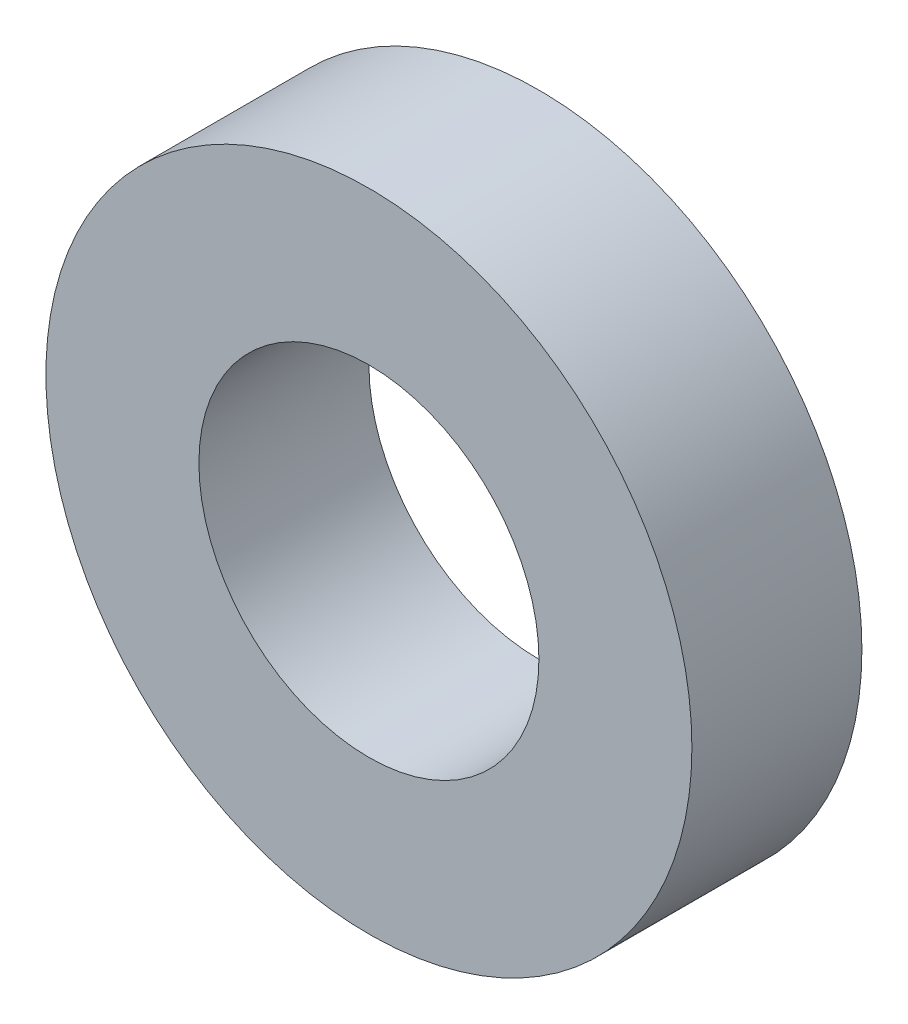
ISO-10303-21;
HEADER;
FILE_DESCRIPTION(('STEP AP214'),'2;1');
FILE_NAME('part.step','',(''),(''),'','','');
FILE_SCHEMA(('AUTOMOTIVE_DESIGN { 1 0 10303 214 1 1 1 1 }'));
ENDSEC;
DATA;
#1=APPLICATION_CONTEXT('core data for automotive mechanical design processes');
#2=APPLICATION_PROTOCOL_DEFINITION('international standard','automotive_design',2000,#1);
#3=PRODUCT_CONTEXT('',#1,'mechanical');
#4=PRODUCT('Part','Part','',(#3));
#5=PRODUCT_RELATED_PRODUCT_CATEGORY('part','',(#4));
#6=PRODUCT_DEFINITION_FORMATION('','',#4);
#7=PRODUCT_DEFINITION_CONTEXT('part definition',#1,'design');
#8=PRODUCT_DEFINITION('design','',#6,#7);
#9=PRODUCT_DEFINITION_SHAPE('','',#8);
#10=(LENGTH_UNIT() NAMED_UNIT(*) SI_UNIT(.MILLI.,.METRE.));
#11=(NAMED_UNIT(*) PLANE_ANGLE_UNIT() SI_UNIT($,.RADIAN.));
#12=(NAMED_UNIT(*) SI_UNIT($,.STERADIAN.) SOLID_ANGLE_UNIT());
#13=UNCERTAINTY_MEASURE_WITH_UNIT(LENGTH_MEASURE(1.E-05),#10,'distance_accuracy_value','');
#14=(GEOMETRIC_REPRESENTATION_CONTEXT(3) GLOBAL_UNCERTAINTY_ASSIGNED_CONTEXT((#13)) GLOBAL_UNIT_ASSIGNED_CONTEXT((#10,
#11,#12)) REPRESENTATION_CONTEXT('',''));
#15=CARTESIAN_POINT('',(0.,0.,0.));
#16=DIRECTION('',(0.,0.,1.));
#17=DIRECTION('',(1.,0.,0.));
#18=AXIS2_PLACEMENT_3D('',#15,#16,#17);
#19=CARTESIAN_POINT('',(0.,0.,5.));
#20=DIRECTION('',(0.,0.,1.));
#21=DIRECTION('',(1.,0.,0.));
#22=AXIS2_PLACEMENT_3D('',#19,#20,#21);
#23=PLANE('',#22);
#24=CARTESIAN_POINT('',(0.,0.,5.));
#25=DIRECTION('',(0.,0.,1.));
#26=DIRECTION('',(1.,0.,0.));
#27=AXIS2_PLACEMENT_3D('',#24,#25,#26);
#28=CIRCLE('',#27,9.5);
#29=CARTESIAN_POINT('',(9.5,0.,5.));
#30=VERTEX_POINT('',#29);
#31=EDGE_CURVE('E10',#30,#30,#28,.T.);
#32=ORIENTED_EDGE('',*,*,#31,.T.);
#33=EDGE_LOOP('',(#32));
#34=FACE_BOUND('',#33,.T.);
#35=CARTESIAN_POINT('',(0.,0.,5.));
#36=DIRECTION('',(0.,0.,1.));
#37=DIRECTION('',(1.,0.,0.));
#38=AXIS2_PLACEMENT_3D('',#35,#36,#37);
#39=CIRCLE('',#38,5.);
#40=CARTESIAN_POINT('',(5.,0.,5.));
#41=VERTEX_POINT('',#40);
#42=EDGE_CURVE('E41',#41,#41,#39,.T.);
#43=ORIENTED_EDGE('',*,*,#42,.F.);
#44=EDGE_LOOP('',(#43));
#45=FACE_BOUND('',#44,.T.);
#46=ADVANCED_FACE('F30',(#34,#45),#23,.T.);
#47=CARTESIAN_POINT('',(0.,0.,0.));
#48=DIRECTION('',(0.,0.,1.));
#49=DIRECTION('',(1.,0.,0.));
#50=AXIS2_PLACEMENT_3D('',#47,#48,#49);
#51=PLANE('',#50);
#52=CARTESIAN_POINT('',(0.,0.,0.));
#53=DIRECTION('',(0.,0.,1.));
#54=DIRECTION('',(1.,0.,0.));
#55=AXIS2_PLACEMENT_3D('',#52,#53,#54);
#56=CIRCLE('',#55,9.5);
#57=CARTESIAN_POINT('',(9.5,0.,0.));
#58=VERTEX_POINT('',#57);
#59=EDGE_CURVE('E34',#58,#58,#56,.T.);
#60=ORIENTED_EDGE('',*,*,#59,.F.);
#61=EDGE_LOOP('',(#60));
#62=FACE_BOUND('',#61,.T.);
#63=CARTESIAN_POINT('',(0.,0.,0.));
#64=DIRECTION('',(0.,0.,1.));
#65=DIRECTION('',(1.,0.,0.));
#66=AXIS2_PLACEMENT_3D('',#63,#64,#65);
#67=CIRCLE('',#66,5.);
#68=CARTESIAN_POINT('',(5.,0.,0.));
#69=VERTEX_POINT('',#68);
#70=EDGE_CURVE('E43',#69,#69,#67,.T.);
#71=ORIENTED_EDGE('',*,*,#70,.T.);
#72=EDGE_LOOP('',(#71));
#73=FACE_BOUND('',#72,.T.);
#74=ADVANCED_FACE('F53',(#62,#73),#51,.F.);
#75=CARTESIAN_POINT('',(0.,0.,5.));
#76=DIRECTION('',(0.,0.,-1.));
#77=DIRECTION('',(-1.,0.,0.));
#78=AXIS2_PLACEMENT_3D('',#75,#76,#77);
#79=CYLINDRICAL_SURFACE('',#78,9.5);
#80=ORIENTED_EDGE('',*,*,#31,.F.);
#81=EDGE_LOOP('',(#80));
#82=FACE_BOUND('',#81,.T.);
#83=ORIENTED_EDGE('',*,*,#59,.T.);
#84=EDGE_LOOP('',(#83));
#85=FACE_BOUND('',#84,.T.);
#86=ADVANCED_FACE('F32',(#82,#85),#79,.T.);
#87=CARTESIAN_POINT('',(0.,0.,5.));
#88=DIRECTION('',(0.,0.,-1.));
#89=DIRECTION('',(-1.,0.,0.));
#90=AXIS2_PLACEMENT_3D('',#87,#88,#89);
#91=CYLINDRICAL_SURFACE('',#90,5.);
#92=ORIENTED_EDGE('',*,*,#42,.T.);
#93=EDGE_LOOP('',(#92));
#94=FACE_BOUND('',#93,.T.);
#95=ORIENTED_EDGE('',*,*,#70,.F.);
#96=EDGE_LOOP('',(#95));
#97=FACE_BOUND('',#96,.T.);
#98=ADVANCED_FACE('F49',(#94,#97),#91,.F.);
#99=CLOSED_SHELL('',(#46,#74,#86,#98));
#100=MANIFOLD_SOLID_BREP('B2',#99);
#101=ADVANCED_BREP_SHAPE_REPRESENTATION('',(#18,#100),#14);
#102=SHAPE_DEFINITION_REPRESENTATION(#9,#101);
ENDSEC;
END-ISO-10303-21;
